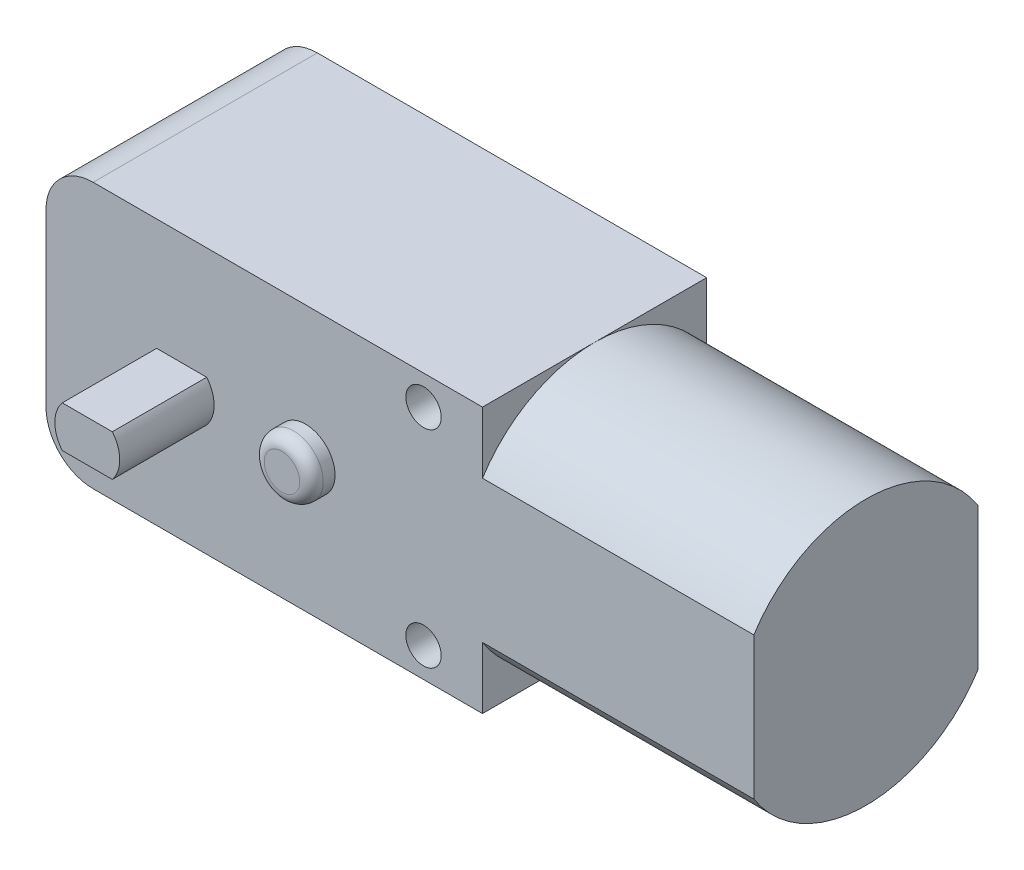
ISO-10303-21;
HEADER;
FILE_DESCRIPTION(('STEP AP214'),'2;1');
FILE_NAME('part.step','',(''),(''),'','','');
FILE_SCHEMA(('AUTOMOTIVE_DESIGN { 1 0 10303 214 1 1 1 1 }'));
ENDSEC;
DATA;
#1=APPLICATION_CONTEXT('core data for automotive mechanical design processes');
#2=APPLICATION_PROTOCOL_DEFINITION('international standard','automotive_design',2000,#1);
#3=PRODUCT_CONTEXT('',#1,'mechanical');
#4=PRODUCT('Part','Part','',(#3));
#5=PRODUCT_RELATED_PRODUCT_CATEGORY('part','',(#4));
#6=PRODUCT_DEFINITION_FORMATION('','',#4);
#7=PRODUCT_DEFINITION_CONTEXT('part definition',#1,'design');
#8=PRODUCT_DEFINITION('design','',#6,#7);
#9=PRODUCT_DEFINITION_SHAPE('','',#8);
#10=(LENGTH_UNIT() NAMED_UNIT(*) SI_UNIT(.MILLI.,.METRE.));
#11=(NAMED_UNIT(*) PLANE_ANGLE_UNIT() SI_UNIT($,.RADIAN.));
#12=(NAMED_UNIT(*) SI_UNIT($,.STERADIAN.) SOLID_ANGLE_UNIT());
#13=UNCERTAINTY_MEASURE_WITH_UNIT(LENGTH_MEASURE(1.E-05),#10,'distance_accuracy_value','');
#14=(GEOMETRIC_REPRESENTATION_CONTEXT(3) GLOBAL_UNCERTAINTY_ASSIGNED_CONTEXT((#13)) GLOBAL_UNIT_ASSIGNED_CONTEXT((#10,
#11,#12)) REPRESENTATION_CONTEXT('',''));
#15=CARTESIAN_POINT('',(0.,0.,0.));
#16=DIRECTION('',(0.,0.,1.));
#17=DIRECTION('',(1.,0.,0.));
#18=AXIS2_PLACEMENT_3D('',#15,#16,#17);
#19=CARTESIAN_POINT('',(-14.5,-7.25,19.));
#20=DIRECTION('',(0.,0.,1.));
#21=DIRECTION('',(1.,0.,0.));
#22=AXIS2_PLACEMENT_3D('',#19,#20,#21);
#23=PLANE('',#22);
#24=CARTESIAN_POINT('',(13.5,8.75,19.));
#25=DIRECTION('',(0.,0.,1.));
#26=DIRECTION('',(1.,0.,0.));
#27=AXIS2_PLACEMENT_3D('',#24,#25,#26);
#28=CIRCLE('',#27,1.5);
#29=CARTESIAN_POINT('',(15.,8.75,19.));
#30=VERTEX_POINT('',#29);
#31=EDGE_CURVE('E535',#30,#30,#28,.T.);
#32=ORIENTED_EDGE('',*,*,#31,.F.);
#33=EDGE_LOOP('',(#32));
#34=FACE_BOUND('',#33,.T.);
#35=CARTESIAN_POINT('',(13.5,-8.75,19.));
#36=DIRECTION('',(0.,0.,1.));
#37=DIRECTION('',(1.,0.,0.));
#38=AXIS2_PLACEMENT_3D('',#35,#36,#37);
#39=CIRCLE('',#38,1.5);
#40=CARTESIAN_POINT('',(15.,-8.75,19.));
#41=VERTEX_POINT('',#40);
#42=EDGE_CURVE('E536',#41,#41,#39,.T.);
#43=ORIENTED_EDGE('',*,*,#42,.F.);
#44=EDGE_LOOP('',(#43));
#45=FACE_BOUND('',#44,.T.);
#46=CARTESIAN_POINT('',(3.50000000000003,0.,19.));
#47=DIRECTION('',(0.,0.,1.));
#48=DIRECTION('',(1.,0.,0.));
#49=AXIS2_PLACEMENT_3D('',#46,#47,#48);
#50=CIRCLE('',#49,2.5);
#51=CARTESIAN_POINT('',(6.00000000000003,0.,19.));
#52=VERTEX_POINT('',#51);
#53=EDGE_CURVE('E538',#52,#52,#50,.T.);
#54=ORIENTED_EDGE('',*,*,#53,.F.);
#55=EDGE_LOOP('',(#54));
#56=FACE_BOUND('',#55,.T.);
#57=DIRECTION('',(0.,1.,0.));
#58=VECTOR('',#57,1.);
#59=CARTESIAN_POINT('',(18.5,11.25,19.));
#60=LINE('',#59,#58);
#61=CARTESIAN_POINT('',(18.5,-11.25,19.));
#62=VERTEX_POINT('',#61);
#63=CARTESIAN_POINT('',(18.5,-6.02598539659697,19.));
#64=VERTEX_POINT('',#63);
#65=EDGE_CURVE('E204',#62,#64,#60,.T.);
#66=ORIENTED_EDGE('',*,*,#65,.T.);
#67=DIRECTION('',(-1.,0.,0.));
#68=VECTOR('',#67,1.);
#69=CARTESIAN_POINT('',(41.5,-6.02598539659697,19.));
#70=LINE('',#69,#68);
#71=CARTESIAN_POINT('',(41.5,-6.02598539659697,19.));
#72=VERTEX_POINT('',#71);
#73=EDGE_CURVE('E187',#72,#64,#70,.T.);
#74=ORIENTED_EDGE('',*,*,#73,.F.);
#75=DIRECTION('',(0.,-1.,0.));
#76=VECTOR('',#75,1.);
#77=CARTESIAN_POINT('',(41.5,6.02598539659697,19.));
#78=LINE('',#77,#76);
#79=CARTESIAN_POINT('',(41.5,6.02598539659697,19.));
#80=VERTEX_POINT('',#79);
#81=EDGE_CURVE('E186',#80,#72,#78,.T.);
#82=ORIENTED_EDGE('',*,*,#81,.F.);
#83=DIRECTION('',(-1.,0.,0.));
#84=VECTOR('',#83,1.);
#85=CARTESIAN_POINT('',(41.5,6.02598539659697,19.));
#86=LINE('',#85,#84);
#87=CARTESIAN_POINT('',(18.5,6.02598539659697,19.));
#88=VERTEX_POINT('',#87);
#89=EDGE_CURVE('E194',#80,#88,#86,.T.);
#90=ORIENTED_EDGE('',*,*,#89,.T.);
#91=CARTESIAN_POINT('',(18.5,11.25,19.));
#92=VERTEX_POINT('',#91);
#93=EDGE_CURVE('E208',#88,#92,#60,.T.);
#94=ORIENTED_EDGE('',*,*,#93,.T.);
#95=DIRECTION('',(-1.,0.,0.));
#96=VECTOR('',#95,1.);
#97=CARTESIAN_POINT('',(-14.4999999999999,11.25,19.));
#98=LINE('',#97,#96);
#99=CARTESIAN_POINT('',(-14.4999999999999,11.25,19.));
#100=VERTEX_POINT('',#99);
#101=EDGE_CURVE('E207',#92,#100,#98,.T.);
#102=ORIENTED_EDGE('',*,*,#101,.T.);
#103=CARTESIAN_POINT('',(-14.5,7.25,19.));
#104=DIRECTION('',(0.,0.,1.));
#105=DIRECTION('',(1.,0.,0.));
#106=AXIS2_PLACEMENT_3D('',#103,#104,#105);
#107=CIRCLE('',#106,4.);
#108=CARTESIAN_POINT('',(-18.5,7.24999999999997,19.));
#109=VERTEX_POINT('',#108);
#110=EDGE_CURVE('E210',#100,#109,#107,.T.);
#111=ORIENTED_EDGE('',*,*,#110,.T.);
#112=DIRECTION('',(0.,-1.,0.));
#113=VECTOR('',#112,1.);
#114=CARTESIAN_POINT('',(-18.5,7.24999999999997,19.));
#115=LINE('',#114,#113);
#116=CARTESIAN_POINT('',(-18.5,-7.24999999999997,19.));
#117=VERTEX_POINT('',#116);
#118=EDGE_CURVE('E212',#109,#117,#115,.T.);
#119=ORIENTED_EDGE('',*,*,#118,.T.);
#120=CARTESIAN_POINT('',(-14.5,-7.25,19.));
#121=DIRECTION('',(0.,0.,1.));
#122=DIRECTION('',(1.,0.,0.));
#123=AXIS2_PLACEMENT_3D('',#120,#121,#122);
#124=CIRCLE('',#123,4.);
#125=CARTESIAN_POINT('',(-14.4999999999999,-11.25,19.));
#126=VERTEX_POINT('',#125);
#127=EDGE_CURVE('E214',#117,#126,#124,.T.);
#128=ORIENTED_EDGE('',*,*,#127,.T.);
#129=DIRECTION('',(1.,0.,0.));
#130=VECTOR('',#129,1.);
#131=CARTESIAN_POINT('',(-14.4999999999999,-11.25,19.));
#132=LINE('',#131,#130);
#133=EDGE_CURVE('E216',#126,#62,#132,.T.);
#134=ORIENTED_EDGE('',*,*,#133,.T.);
#135=EDGE_LOOP('',(#66,#74,#82,#90,#94,#102,#111,#119,#128,#134));
#136=FACE_BOUND('',#135,.T.);
#137=DIRECTION('',(-1.,0.,0.));
#138=VECTOR('',#137,1.);
#139=CARTESIAN_POINT('',(-9.12132034355962,1.75,19.));
#140=LINE('',#139,#138);
#141=CARTESIAN_POINT('',(-4.87867965644033,1.75,19.));
#142=VERTEX_POINT('',#141);
#143=CARTESIAN_POINT('',(-9.12132034355962,1.75,19.));
#144=VERTEX_POINT('',#143);
#145=EDGE_CURVE('E552',#142,#144,#140,.T.);
#146=ORIENTED_EDGE('',*,*,#145,.F.);
#147=CARTESIAN_POINT('',(-6.99999999999998,0.,19.));
#148=DIRECTION('',(0.,0.,1.));
#149=DIRECTION('',(1.,0.,0.));
#150=AXIS2_PLACEMENT_3D('',#147,#148,#149);
#151=CIRCLE('',#150,2.75);
#152=CARTESIAN_POINT('',(-4.87867965644033,-1.75,19.));
#153=VERTEX_POINT('',#152);
#154=EDGE_CURVE('E169',#153,#142,#151,.T.);
#155=ORIENTED_EDGE('',*,*,#154,.F.);
#156=DIRECTION('',(1.,0.,0.));
#157=VECTOR('',#156,1.);
#158=CARTESIAN_POINT('',(-9.12132034355962,-1.75,19.));
#159=LINE('',#158,#157);
#160=CARTESIAN_POINT('',(-9.12132034355962,-1.75,19.));
#161=VERTEX_POINT('',#160);
#162=EDGE_CURVE('E165',#161,#153,#159,.T.);
#163=ORIENTED_EDGE('',*,*,#162,.F.);
#164=CARTESIAN_POINT('',(-6.99999999999998,0.,19.));
#165=DIRECTION('',(0.,0.,1.));
#166=DIRECTION('',(1.,0.,0.));
#167=AXIS2_PLACEMENT_3D('',#164,#165,#166);
#168=CIRCLE('',#167,2.75);
#169=EDGE_CURVE('E554',#144,#161,#168,.T.);
#170=ORIENTED_EDGE('',*,*,#169,.F.);
#171=EDGE_LOOP('',(#146,#155,#163,#170));
#172=FACE_BOUND('',#171,.T.);
#173=ADVANCED_FACE('F39',(#34,#45,#56,#136,#172),#23,.T.);
#174=CARTESIAN_POINT('',(18.5,11.25,19.));
#175=DIRECTION('',(-1.,0.,0.));
#176=DIRECTION('',(0.,0.,1.));
#177=AXIS2_PLACEMENT_3D('',#174,#175,#176);
#178=PLANE('',#177);
#179=CARTESIAN_POINT('',(18.5,0.,9.5));
#180=DIRECTION('',(1.,0.,0.));
#181=DIRECTION('',(0.,0.,-1.));
#182=AXIS2_PLACEMENT_3D('',#179,#180,#181);
#183=CIRCLE('',#182,11.25);
#184=CARTESIAN_POINT('',(18.5,-11.25,9.5));
#185=VERTEX_POINT('',#184);
#186=EDGE_CURVE('E171',#64,#185,#183,.T.);
#187=ORIENTED_EDGE('',*,*,#186,.F.);
#188=ORIENTED_EDGE('',*,*,#65,.F.);
#189=DIRECTION('',(0.,0.,-1.));
#190=VECTOR('',#189,1.);
#191=CARTESIAN_POINT('',(18.5,-11.25,19.));
#192=LINE('',#191,#190);
#193=EDGE_CURVE('E232',#62,#185,#192,.T.);
#194=ORIENTED_EDGE('',*,*,#193,.T.);
#195=EDGE_LOOP('',(#187,#188,#194));
#196=FACE_BOUND('',#195,.T.);
#197=ADVANCED_FACE('F286',(#196),#178,.F.);
#198=CARTESIAN_POINT('',(18.5,-6.02598539659697,0.));
#199=VERTEX_POINT('',#198);
#200=EDGE_CURVE('E62',#185,#199,#183,.T.);
#201=ORIENTED_EDGE('',*,*,#200,.F.);
#202=CARTESIAN_POINT('',(18.5,-11.25,0.));
#203=VERTEX_POINT('',#202);
#204=EDGE_CURVE('E218',#185,#203,#192,.T.);
#205=ORIENTED_EDGE('',*,*,#204,.T.);
#206=DIRECTION('',(0.,1.,0.));
#207=VECTOR('',#206,1.);
#208=CARTESIAN_POINT('',(18.5,11.25,0.));
#209=LINE('',#208,#207);
#210=EDGE_CURVE('E219',#203,#199,#209,.T.);
#211=ORIENTED_EDGE('',*,*,#210,.T.);
#212=EDGE_LOOP('',(#201,#205,#211));
#213=FACE_BOUND('',#212,.T.);
#214=ADVANCED_FACE('F293',(#213),#178,.F.);
#215=CARTESIAN_POINT('',(18.5,0.,9.5));
#216=DIRECTION('',(1.,0.,0.));
#217=DIRECTION('',(0.,0.,-1.));
#218=AXIS2_PLACEMENT_3D('',#215,#216,#217);
#219=CIRCLE('',#218,11.25);
#220=CARTESIAN_POINT('',(18.5,6.02598539659697,0.));
#221=VERTEX_POINT('',#220);
#222=CARTESIAN_POINT('',(18.5,11.25,9.5));
#223=VERTEX_POINT('',#222);
#224=EDGE_CURVE('E174',#221,#223,#219,.T.);
#225=ORIENTED_EDGE('',*,*,#224,.F.);
#226=CARTESIAN_POINT('',(18.5,11.25,0.));
#227=VERTEX_POINT('',#226);
#228=EDGE_CURVE('E203',#221,#227,#209,.T.);
#229=ORIENTED_EDGE('',*,*,#228,.T.);
#230=DIRECTION('',(0.,0.,-1.));
#231=VECTOR('',#230,1.);
#232=CARTESIAN_POINT('',(18.5,11.25,19.));
#233=LINE('',#232,#231);
#234=EDGE_CURVE('E247',#223,#227,#233,.T.);
#235=ORIENTED_EDGE('',*,*,#234,.F.);
#236=EDGE_LOOP('',(#225,#229,#235));
#237=FACE_BOUND('',#236,.T.);
#238=ADVANCED_FACE('F280',(#237),#178,.F.);
#239=EDGE_CURVE('E191',#223,#88,#219,.T.);
#240=ORIENTED_EDGE('',*,*,#239,.F.);
#241=EDGE_CURVE('E248',#92,#223,#233,.T.);
#242=ORIENTED_EDGE('',*,*,#241,.F.);
#243=ORIENTED_EDGE('',*,*,#93,.F.);
#244=EDGE_LOOP('',(#240,#242,#243));
#245=FACE_BOUND('',#244,.T.);
#246=ADVANCED_FACE('F284',(#245),#178,.F.);
#247=CARTESIAN_POINT('',(-14.4999999999999,11.25,19.));
#248=DIRECTION('',(0.,-1.,0.));
#249=DIRECTION('',(0.,0.,-1.));
#250=AXIS2_PLACEMENT_3D('',#247,#248,#249);
#251=PLANE('',#250);
#252=DIRECTION('',(-1.,0.,0.));
#253=VECTOR('',#252,1.);
#254=CARTESIAN_POINT('',(-14.4999999999999,11.25,0.));
#255=LINE('',#254,#253);
#256=CARTESIAN_POINT('',(-14.4999999999999,11.25,0.));
#257=VERTEX_POINT('',#256);
#258=EDGE_CURVE('E221',#227,#257,#255,.T.);
#259=ORIENTED_EDGE('',*,*,#258,.T.);
#260=DIRECTION('',(0.,0.,-1.));
#261=VECTOR('',#260,1.);
#262=CARTESIAN_POINT('',(-14.4999999999999,11.25,19.));
#263=LINE('',#262,#261);
#264=EDGE_CURVE('E244',#100,#257,#263,.T.);
#265=ORIENTED_EDGE('',*,*,#264,.F.);
#266=ORIENTED_EDGE('',*,*,#101,.F.);
#267=ORIENTED_EDGE('',*,*,#241,.T.);
#268=ORIENTED_EDGE('',*,*,#234,.T.);
#269=EDGE_LOOP('',(#259,#265,#266,#267,#268));
#270=FACE_BOUND('',#269,.T.);
#271=ADVANCED_FACE('F282',(#270),#251,.F.);
#272=CARTESIAN_POINT('',(-14.5,7.25,19.));
#273=DIRECTION('',(0.,0.,-1.));
#274=DIRECTION('',(-1.,0.,0.));
#275=AXIS2_PLACEMENT_3D('',#272,#273,#274);
#276=CYLINDRICAL_SURFACE('',#275,4.);
#277=CARTESIAN_POINT('',(-14.5,7.25,0.));
#278=DIRECTION('',(0.,0.,1.));
#279=DIRECTION('',(1.,0.,0.));
#280=AXIS2_PLACEMENT_3D('',#277,#278,#279);
#281=CIRCLE('',#280,4.);
#282=CARTESIAN_POINT('',(-18.5,7.24999999999997,0.));
#283=VERTEX_POINT('',#282);
#284=EDGE_CURVE('E223',#257,#283,#281,.T.);
#285=ORIENTED_EDGE('',*,*,#284,.T.);
#286=DIRECTION('',(0.,0.,-1.));
#287=VECTOR('',#286,1.);
#288=CARTESIAN_POINT('',(-18.5,7.24999999999997,19.));
#289=LINE('',#288,#287);
#290=EDGE_CURVE('E241',#109,#283,#289,.T.);
#291=ORIENTED_EDGE('',*,*,#290,.F.);
#292=ORIENTED_EDGE('',*,*,#110,.F.);
#293=ORIENTED_EDGE('',*,*,#264,.T.);
#294=EDGE_LOOP('',(#285,#291,#292,#293));
#295=FACE_BOUND('',#294,.T.);
#296=ADVANCED_FACE('F291',(#295),#276,.T.);
#297=CARTESIAN_POINT('',(-18.5,7.24999999999997,19.));
#298=DIRECTION('',(1.,0.,0.));
#299=DIRECTION('',(0.,0.,-1.));
#300=AXIS2_PLACEMENT_3D('',#297,#298,#299);
#301=PLANE('',#300);
#302=DIRECTION('',(0.,-1.,0.));
#303=VECTOR('',#302,1.);
#304=CARTESIAN_POINT('',(-18.5,7.24999999999997,0.));
#305=LINE('',#304,#303);
#306=CARTESIAN_POINT('',(-18.5,-7.24999999999997,0.));
#307=VERTEX_POINT('',#306);
#308=EDGE_CURVE('E225',#283,#307,#305,.T.);
#309=ORIENTED_EDGE('',*,*,#308,.T.);
#310=DIRECTION('',(0.,0.,-1.));
#311=VECTOR('',#310,1.);
#312=CARTESIAN_POINT('',(-18.5,-7.24999999999997,19.));
#313=LINE('',#312,#311);
#314=EDGE_CURVE('E238',#117,#307,#313,.T.);
#315=ORIENTED_EDGE('',*,*,#314,.F.);
#316=ORIENTED_EDGE('',*,*,#118,.F.);
#317=ORIENTED_EDGE('',*,*,#290,.T.);
#318=EDGE_LOOP('',(#309,#315,#316,#317));
#319=FACE_BOUND('',#318,.T.);
#320=ADVANCED_FACE('F317',(#319),#301,.F.);
#321=CARTESIAN_POINT('',(-14.5,-7.25,19.));
#322=DIRECTION('',(0.,0.,-1.));
#323=DIRECTION('',(-1.,0.,0.));
#324=AXIS2_PLACEMENT_3D('',#321,#322,#323);
#325=CYLINDRICAL_SURFACE('',#324,4.);
#326=CARTESIAN_POINT('',(-14.5,-7.25,0.));
#327=DIRECTION('',(0.,0.,1.));
#328=DIRECTION('',(1.,0.,0.));
#329=AXIS2_PLACEMENT_3D('',#326,#327,#328);
#330=CIRCLE('',#329,4.);
#331=CARTESIAN_POINT('',(-14.4999999999999,-11.25,0.));
#332=VERTEX_POINT('',#331);
#333=EDGE_CURVE('E227',#307,#332,#330,.T.);
#334=ORIENTED_EDGE('',*,*,#333,.T.);
#335=DIRECTION('',(0.,0.,-1.));
#336=VECTOR('',#335,1.);
#337=CARTESIAN_POINT('',(-14.4999999999999,-11.25,19.));
#338=LINE('',#337,#336);
#339=EDGE_CURVE('E235',#126,#332,#338,.T.);
#340=ORIENTED_EDGE('',*,*,#339,.F.);
#341=ORIENTED_EDGE('',*,*,#127,.F.);
#342=ORIENTED_EDGE('',*,*,#314,.T.);
#343=EDGE_LOOP('',(#334,#340,#341,#342));
#344=FACE_BOUND('',#343,.T.);
#345=ADVANCED_FACE('F313',(#344),#325,.T.);
#346=CARTESIAN_POINT('',(-14.4999999999999,-11.25,19.));
#347=DIRECTION('',(0.,1.,0.));
#348=DIRECTION('',(0.,0.,1.));
#349=AXIS2_PLACEMENT_3D('',#346,#347,#348);
#350=PLANE('',#349);
#351=DIRECTION('',(1.,0.,0.));
#352=VECTOR('',#351,1.);
#353=CARTESIAN_POINT('',(-14.4999999999999,-11.25,0.));
#354=LINE('',#353,#352);
#355=EDGE_CURVE('E229',#332,#203,#354,.T.);
#356=ORIENTED_EDGE('',*,*,#355,.T.);
#357=ORIENTED_EDGE('',*,*,#204,.F.);
#358=ORIENTED_EDGE('',*,*,#193,.F.);
#359=ORIENTED_EDGE('',*,*,#133,.F.);
#360=ORIENTED_EDGE('',*,*,#339,.T.);
#361=EDGE_LOOP('',(#356,#357,#358,#359,#360));
#362=FACE_BOUND('',#361,.T.);
#363=ADVANCED_FACE('F309',(#362),#350,.F.);
#364=CARTESIAN_POINT('',(-14.5,-7.25,0.));
#365=DIRECTION('',(0.,0.,1.));
#366=DIRECTION('',(1.,0.,0.));
#367=AXIS2_PLACEMENT_3D('',#364,#365,#366);
#368=PLANE('',#367);
#369=CARTESIAN_POINT('',(13.5,8.75,0.));
#370=DIRECTION('',(0.,0.,1.));
#371=DIRECTION('',(1.,0.,0.));
#372=AXIS2_PLACEMENT_3D('',#369,#370,#371);
#373=CIRCLE('',#372,1.5);
#374=CARTESIAN_POINT('',(15.,8.75,0.));
#375=VERTEX_POINT('',#374);
#376=EDGE_CURVE('E533',#375,#375,#373,.T.);
#377=ORIENTED_EDGE('',*,*,#376,.T.);
#378=EDGE_LOOP('',(#377));
#379=FACE_BOUND('',#378,.T.);
#380=CARTESIAN_POINT('',(13.5,-8.75,0.));
#381=DIRECTION('',(0.,0.,1.));
#382=DIRECTION('',(1.,0.,0.));
#383=AXIS2_PLACEMENT_3D('',#380,#381,#382);
#384=CIRCLE('',#383,1.5);
#385=CARTESIAN_POINT('',(15.,-8.75,0.));
#386=VERTEX_POINT('',#385);
#387=EDGE_CURVE('E541',#386,#386,#384,.T.);
#388=ORIENTED_EDGE('',*,*,#387,.T.);
#389=EDGE_LOOP('',(#388));
#390=FACE_BOUND('',#389,.T.);
#391=ORIENTED_EDGE('',*,*,#210,.F.);
#392=ORIENTED_EDGE('',*,*,#355,.F.);
#393=ORIENTED_EDGE('',*,*,#333,.F.);
#394=ORIENTED_EDGE('',*,*,#308,.F.);
#395=ORIENTED_EDGE('',*,*,#284,.F.);
#396=ORIENTED_EDGE('',*,*,#258,.F.);
#397=ORIENTED_EDGE('',*,*,#228,.F.);
#398=DIRECTION('',(-1.,0.,0.));
#399=VECTOR('',#398,1.);
#400=CARTESIAN_POINT('',(41.5,6.02598539659697,0.));
#401=LINE('',#400,#399);
#402=CARTESIAN_POINT('',(41.5,6.02598539659697,0.));
#403=VERTEX_POINT('',#402);
#404=EDGE_CURVE('E197',#403,#221,#401,.T.);
#405=ORIENTED_EDGE('',*,*,#404,.F.);
#406=DIRECTION('',(0.,1.,0.));
#407=VECTOR('',#406,1.);
#408=CARTESIAN_POINT('',(41.5,-6.02598539659697,0.));
#409=LINE('',#408,#407);
#410=CARTESIAN_POINT('',(41.5,-6.02598539659697,0.));
#411=VERTEX_POINT('',#410);
#412=EDGE_CURVE('E182',#411,#403,#409,.T.);
#413=ORIENTED_EDGE('',*,*,#412,.F.);
#414=DIRECTION('',(-1.,0.,0.));
#415=VECTOR('',#414,1.);
#416=CARTESIAN_POINT('',(41.5,-6.02598539659697,0.));
#417=LINE('',#416,#415);
#418=EDGE_CURVE('E200',#411,#199,#417,.T.);
#419=ORIENTED_EDGE('',*,*,#418,.T.);
#420=EDGE_LOOP('',(#391,#392,#393,#394,#395,#396,#397,#405,#413,#419));
#421=FACE_BOUND('',#420,.T.);
#422=ADVANCED_FACE('F275',(#379,#390,#421),#368,.F.);
#423=CARTESIAN_POINT('',(41.5,0.,9.5));
#424=DIRECTION('',(-1.,0.,0.));
#425=DIRECTION('',(0.,0.,1.));
#426=AXIS2_PLACEMENT_3D('',#423,#424,#425);
#427=CYLINDRICAL_SURFACE('',#426,11.25);
#428=ORIENTED_EDGE('',*,*,#186,.T.);
#429=ORIENTED_EDGE('',*,*,#200,.T.);
#430=ORIENTED_EDGE('',*,*,#418,.F.);
#431=CARTESIAN_POINT('',(41.5,0.,9.5));
#432=DIRECTION('',(1.,0.,0.));
#433=DIRECTION('',(0.,0.,-1.));
#434=AXIS2_PLACEMENT_3D('',#431,#432,#433);
#435=CIRCLE('',#434,11.25);
#436=EDGE_CURVE('E179',#72,#411,#435,.T.);
#437=ORIENTED_EDGE('',*,*,#436,.F.);
#438=ORIENTED_EDGE('',*,*,#73,.T.);
#439=EDGE_LOOP('',(#428,#429,#430,#437,#438));
#440=FACE_BOUND('',#439,.T.);
#441=ADVANCED_FACE('F305',(#440),#427,.T.);
#442=CARTESIAN_POINT('',(41.5,0.,9.5));
#443=DIRECTION('',(-1.,0.,0.));
#444=DIRECTION('',(0.,0.,1.));
#445=AXIS2_PLACEMENT_3D('',#442,#443,#444);
#446=CYLINDRICAL_SURFACE('',#445,11.25);
#447=ORIENTED_EDGE('',*,*,#224,.T.);
#448=ORIENTED_EDGE('',*,*,#239,.T.);
#449=ORIENTED_EDGE('',*,*,#89,.F.);
#450=CARTESIAN_POINT('',(41.5,0.,9.5));
#451=DIRECTION('',(1.,0.,0.));
#452=DIRECTION('',(0.,0.,-1.));
#453=AXIS2_PLACEMENT_3D('',#450,#451,#452);
#454=CIRCLE('',#453,11.25);
#455=EDGE_CURVE('E184',#403,#80,#454,.T.);
#456=ORIENTED_EDGE('',*,*,#455,.F.);
#457=ORIENTED_EDGE('',*,*,#404,.T.);
#458=EDGE_LOOP('',(#447,#448,#449,#456,#457));
#459=FACE_BOUND('',#458,.T.);
#460=ADVANCED_FACE('F258',(#459),#446,.T.);
#461=CARTESIAN_POINT('',(41.5,0.,9.5));
#462=DIRECTION('',(1.,0.,0.));
#463=DIRECTION('',(0.,0.,-1.));
#464=AXIS2_PLACEMENT_3D('',#461,#462,#463);
#465=PLANE('',#464);
#466=ORIENTED_EDGE('',*,*,#436,.T.);
#467=ORIENTED_EDGE('',*,*,#412,.T.);
#468=ORIENTED_EDGE('',*,*,#455,.T.);
#469=ORIENTED_EDGE('',*,*,#81,.T.);
#470=EDGE_LOOP('',(#466,#467,#468,#469));
#471=FACE_BOUND('',#470,.T.);
#472=ADVANCED_FACE('F270',(#471),#465,.T.);
#473=CARTESIAN_POINT('',(-6.99999999999998,0.,27.));
#474=DIRECTION('',(0.,0.,-1.));
#475=DIRECTION('',(-1.,0.,0.));
#476=AXIS2_PLACEMENT_3D('',#473,#474,#475);
#477=CYLINDRICAL_SURFACE('',#476,2.75);
#478=ORIENTED_EDGE('',*,*,#154,.T.);
#479=DIRECTION('',(0.,0.,-1.));
#480=VECTOR('',#479,1.);
#481=CARTESIAN_POINT('',(-4.87867965644033,1.75,27.));
#482=LINE('',#481,#480);
#483=CARTESIAN_POINT('',(-4.87867965644033,1.75,27.));
#484=VERTEX_POINT('',#483);
#485=EDGE_CURVE('E150',#484,#142,#482,.T.);
#486=ORIENTED_EDGE('',*,*,#485,.F.);
#487=CARTESIAN_POINT('',(-6.99999999999998,0.,27.));
#488=DIRECTION('',(0.,0.,1.));
#489=DIRECTION('',(1.,0.,0.));
#490=AXIS2_PLACEMENT_3D('',#487,#488,#489);
#491=CIRCLE('',#490,2.75);
#492=CARTESIAN_POINT('',(-4.87867965644033,-1.75,27.));
#493=VERTEX_POINT('',#492);
#494=EDGE_CURVE('E157',#493,#484,#491,.T.);
#495=ORIENTED_EDGE('',*,*,#494,.F.);
#496=DIRECTION('',(0.,0.,-1.));
#497=VECTOR('',#496,1.);
#498=CARTESIAN_POINT('',(-4.87867965644033,-1.75,27.));
#499=LINE('',#498,#497);
#500=EDGE_CURVE('E550',#493,#153,#499,.T.);
#501=ORIENTED_EDGE('',*,*,#500,.T.);
#502=EDGE_LOOP('',(#478,#486,#495,#501));
#503=FACE_BOUND('',#502,.T.);
#504=ADVANCED_FACE('F167',(#503),#477,.T.);
#505=CARTESIAN_POINT('',(-9.12132034355962,1.75,27.));
#506=DIRECTION('',(0.,-1.,0.));
#507=DIRECTION('',(1.,0.,0.));
#508=AXIS2_PLACEMENT_3D('',#505,#506,#507);
#509=PLANE('',#508);
#510=ORIENTED_EDGE('',*,*,#145,.T.);
#511=DIRECTION('',(0.,0.,-1.));
#512=VECTOR('',#511,1.);
#513=CARTESIAN_POINT('',(-9.12132034355962,1.75,27.));
#514=LINE('',#513,#512);
#515=CARTESIAN_POINT('',(-9.12132034355962,1.75,27.));
#516=VERTEX_POINT('',#515);
#517=EDGE_CURVE('E153',#516,#144,#514,.T.);
#518=ORIENTED_EDGE('',*,*,#517,.F.);
#519=DIRECTION('',(-1.,0.,0.));
#520=VECTOR('',#519,1.);
#521=CARTESIAN_POINT('',(-9.12132034355962,1.75,27.));
#522=LINE('',#521,#520);
#523=EDGE_CURVE('E146',#484,#516,#522,.T.);
#524=ORIENTED_EDGE('',*,*,#523,.F.);
#525=ORIENTED_EDGE('',*,*,#485,.T.);
#526=EDGE_LOOP('',(#510,#518,#524,#525));
#527=FACE_BOUND('',#526,.T.);
#528=ADVANCED_FACE('F148',(#527),#509,.F.);
#529=CARTESIAN_POINT('',(-6.99999999999998,0.,27.));
#530=DIRECTION('',(0.,0.,-1.));
#531=DIRECTION('',(-1.,0.,0.));
#532=AXIS2_PLACEMENT_3D('',#529,#530,#531);
#533=CYLINDRICAL_SURFACE('',#532,2.75);
#534=ORIENTED_EDGE('',*,*,#169,.T.);
#535=DIRECTION('',(0.,0.,-1.));
#536=VECTOR('',#535,1.);
#537=CARTESIAN_POINT('',(-9.12132034355962,-1.75,27.));
#538=LINE('',#537,#536);
#539=CARTESIAN_POINT('',(-9.12132034355962,-1.75,27.));
#540=VERTEX_POINT('',#539);
#541=EDGE_CURVE('E54',#540,#161,#538,.T.);
#542=ORIENTED_EDGE('',*,*,#541,.F.);
#543=CARTESIAN_POINT('',(-6.99999999999998,0.,27.));
#544=DIRECTION('',(0.,0.,1.));
#545=DIRECTION('',(1.,0.,0.));
#546=AXIS2_PLACEMENT_3D('',#543,#544,#545);
#547=CIRCLE('',#546,2.75);
#548=EDGE_CURVE('E156',#516,#540,#547,.T.);
#549=ORIENTED_EDGE('',*,*,#548,.F.);
#550=ORIENTED_EDGE('',*,*,#517,.T.);
#551=EDGE_LOOP('',(#534,#542,#549,#550));
#552=FACE_BOUND('',#551,.T.);
#553=ADVANCED_FACE('F424',(#552),#533,.T.);
#554=CARTESIAN_POINT('',(-9.12132034355962,-1.75,27.));
#555=DIRECTION('',(0.,1.,0.));
#556=DIRECTION('',(-1.,0.,0.));
#557=AXIS2_PLACEMENT_3D('',#554,#555,#556);
#558=PLANE('',#557);
#559=ORIENTED_EDGE('',*,*,#162,.T.);
#560=ORIENTED_EDGE('',*,*,#500,.F.);
#561=DIRECTION('',(1.,0.,0.));
#562=VECTOR('',#561,1.);
#563=CARTESIAN_POINT('',(-9.12132034355962,-1.75,27.));
#564=LINE('',#563,#562);
#565=EDGE_CURVE('E161',#540,#493,#564,.T.);
#566=ORIENTED_EDGE('',*,*,#565,.F.);
#567=ORIENTED_EDGE('',*,*,#541,.T.);
#568=EDGE_LOOP('',(#559,#560,#566,#567));
#569=FACE_BOUND('',#568,.T.);
#570=ADVANCED_FACE('F435',(#569),#558,.F.);
#571=CARTESIAN_POINT('',(-6.99999999999998,0.,27.));
#572=DIRECTION('',(0.,0.,1.));
#573=DIRECTION('',(1.,0.,0.));
#574=AXIS2_PLACEMENT_3D('',#571,#572,#573);
#575=PLANE('',#574);
#576=ORIENTED_EDGE('',*,*,#494,.T.);
#577=ORIENTED_EDGE('',*,*,#523,.T.);
#578=ORIENTED_EDGE('',*,*,#548,.T.);
#579=ORIENTED_EDGE('',*,*,#565,.T.);
#580=EDGE_LOOP('',(#576,#577,#578,#579));
#581=FACE_BOUND('',#580,.T.);
#582=ADVANCED_FACE('F160',(#581),#575,.T.);
#583=CARTESIAN_POINT('',(3.50000000000003,0.,21.));
#584=DIRECTION('',(0.,0.,-1.));
#585=DIRECTION('',(-1.,0.,0.));
#586=AXIS2_PLACEMENT_3D('',#583,#584,#585);
#587=CYLINDRICAL_SURFACE('',#586,2.5);
#588=CARTESIAN_POINT('',(3.50000000000003,0.,20.));
#589=DIRECTION('',(0.,0.,1.));
#590=DIRECTION('',(1.,0.,0.));
#591=AXIS2_PLACEMENT_3D('',#588,#589,#590);
#592=CIRCLE('',#591,2.5);
#593=CARTESIAN_POINT('',(6.00000000000003,0.,20.));
#594=VERTEX_POINT('',#593);
#595=EDGE_CURVE('E11',#594,#594,#592,.F.);
#596=ORIENTED_EDGE('',*,*,#595,.T.);
#597=EDGE_LOOP('',(#596));
#598=FACE_BOUND('',#597,.T.);
#599=ORIENTED_EDGE('',*,*,#53,.T.);
#600=EDGE_LOOP('',(#599));
#601=FACE_BOUND('',#600,.T.);
#602=ADVANCED_FACE('F455',(#598,#601),#587,.T.);
#603=CARTESIAN_POINT('',(3.50000000000003,0.,21.));
#604=DIRECTION('',(0.,0.,1.));
#605=DIRECTION('',(1.,0.,0.));
#606=AXIS2_PLACEMENT_3D('',#603,#604,#605);
#607=PLANE('',#606);
#608=CARTESIAN_POINT('',(3.50000000000003,0.,21.));
#609=DIRECTION('',(0.,0.,1.));
#610=DIRECTION('',(1.,0.,0.));
#611=AXIS2_PLACEMENT_3D('',#608,#609,#610);
#612=CIRCLE('',#611,1.5);
#613=CARTESIAN_POINT('',(5.00000000000002,0.,21.));
#614=VERTEX_POINT('',#613);
#615=EDGE_CURVE('E47',#614,#614,#612,.T.);
#616=ORIENTED_EDGE('',*,*,#615,.T.);
#617=EDGE_LOOP('',(#616));
#618=FACE_BOUND('',#617,.T.);
#619=ADVANCED_FACE('F465',(#618),#607,.T.);
#620=CARTESIAN_POINT('',(3.50000000000003,0.,20.));
#621=DIRECTION('',(0.,0.,1.));
#622=DIRECTION('',(1.,0.,0.));
#623=AXIS2_PLACEMENT_3D('',#620,#621,#622);
#624=TOROIDAL_SURFACE('',#623,1.5,1.);
#625=ORIENTED_EDGE('',*,*,#595,.F.);
#626=EDGE_LOOP('',(#625));
#627=FACE_BOUND('',#626,.T.);
#628=ORIENTED_EDGE('',*,*,#615,.F.);
#629=EDGE_LOOP('',(#628));
#630=FACE_BOUND('',#629,.T.);
#631=ADVANCED_FACE('F41',(#627,#630),#624,.T.);
#632=CARTESIAN_POINT('',(13.5,-8.75,0.));
#633=DIRECTION('',(0.,0.,1.));
#634=DIRECTION('',(1.,0.,0.));
#635=AXIS2_PLACEMENT_3D('',#632,#633,#634);
#636=CYLINDRICAL_SURFACE('',#635,1.5);
#637=ORIENTED_EDGE('',*,*,#387,.F.);
#638=EDGE_LOOP('',(#637));
#639=FACE_BOUND('',#638,.T.);
#640=ORIENTED_EDGE('',*,*,#42,.T.);
#641=EDGE_LOOP('',(#640));
#642=FACE_BOUND('',#641,.T.);
#643=ADVANCED_FACE('F484',(#639,#642),#636,.F.);
#644=CARTESIAN_POINT('',(13.5,8.75,0.));
#645=DIRECTION('',(0.,0.,1.));
#646=DIRECTION('',(1.,0.,0.));
#647=AXIS2_PLACEMENT_3D('',#644,#645,#646);
#648=CYLINDRICAL_SURFACE('',#647,1.5);
#649=ORIENTED_EDGE('',*,*,#376,.F.);
#650=EDGE_LOOP('',(#649));
#651=FACE_BOUND('',#650,.T.);
#652=ORIENTED_EDGE('',*,*,#31,.T.);
#653=EDGE_LOOP('',(#652));
#654=FACE_BOUND('',#653,.T.);
#655=ADVANCED_FACE('F504',(#651,#654),#648,.F.);
#656=CLOSED_SHELL('',(#173,#197,#214,#238,#246,#271,#296,#320,#345,#363,#422,#441,#460,#472,
#504,#528,#553,#570,#582,#602,#619,#631,#643,#655));
#657=MANIFOLD_SOLID_BREP('B2',#656);
#658=ADVANCED_BREP_SHAPE_REPRESENTATION('',(#18,#657),#14);
#659=SHAPE_DEFINITION_REPRESENTATION(#9,#658);
ENDSEC;
END-ISO-10303-21;
